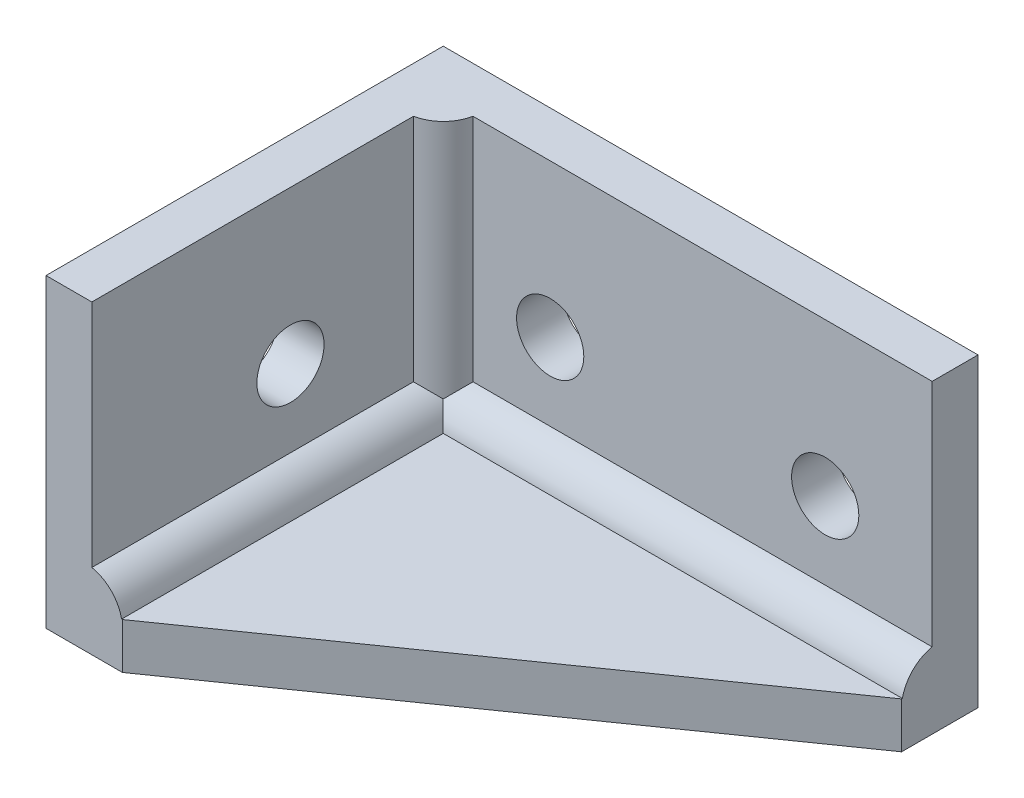
ISO-10303-21;
HEADER;
FILE_DESCRIPTION(('STEP AP214'),'2;1');
FILE_NAME('part.step','',(''),(''),'','','');
FILE_SCHEMA(('AUTOMOTIVE_DESIGN { 1 0 10303 214 1 1 1 1 }'));
ENDSEC;
DATA;
#1=APPLICATION_CONTEXT('core data for automotive mechanical design processes');
#2=APPLICATION_PROTOCOL_DEFINITION('international standard','automotive_design',2000,#1);
#3=PRODUCT_CONTEXT('',#1,'mechanical');
#4=PRODUCT('Part','Part','',(#3));
#5=PRODUCT_RELATED_PRODUCT_CATEGORY('part','',(#4));
#6=PRODUCT_DEFINITION_FORMATION('','',#4);
#7=PRODUCT_DEFINITION_CONTEXT('part definition',#1,'design');
#8=PRODUCT_DEFINITION('design','',#6,#7);
#9=PRODUCT_DEFINITION_SHAPE('','',#8);
#10=(LENGTH_UNIT() NAMED_UNIT(*) SI_UNIT(.MILLI.,.METRE.));
#11=(NAMED_UNIT(*) PLANE_ANGLE_UNIT() SI_UNIT($,.RADIAN.));
#12=(NAMED_UNIT(*) SI_UNIT($,.STERADIAN.) SOLID_ANGLE_UNIT());
#13=UNCERTAINTY_MEASURE_WITH_UNIT(LENGTH_MEASURE(1.E-05),#10,'distance_accuracy_value','');
#14=(GEOMETRIC_REPRESENTATION_CONTEXT(3) GLOBAL_UNCERTAINTY_ASSIGNED_CONTEXT((#13)) GLOBAL_UNIT_ASSIGNED_CONTEXT((#10,
#11,#12)) REPRESENTATION_CONTEXT('',''));
#15=CARTESIAN_POINT('',(0.,0.,0.));
#16=DIRECTION('',(0.,0.,1.));
#17=DIRECTION('',(1.,0.,0.));
#18=AXIS2_PLACEMENT_3D('',#15,#16,#17);
#19=CARTESIAN_POINT('',(35.,20.,5.));
#20=DIRECTION('',(-0.573462344363328,0.,-0.81923192051904));
#21=DIRECTION('',(-0.819231920519041,0.,0.573462344363328));
#22=AXIS2_PLACEMENT_3D('',#19,#20,#21);
#23=PLANE('',#22);
#24=DIRECTION('',(0.81923192051904,0.,-0.573462344363328));
#25=VECTOR('',#24,1.);
#26=CARTESIAN_POINT('',(5.,3.,26.));
#27=LINE('',#26,#25);
#28=CARTESIAN_POINT('',(5.,3.,26.));
#29=VERTEX_POINT('',#28);
#30=CARTESIAN_POINT('',(35.,3.,5.));
#31=VERTEX_POINT('',#30);
#32=EDGE_CURVE('E161',#29,#31,#27,.T.);
#33=ORIENTED_EDGE('',*,*,#32,.F.);
#34=DIRECTION('',(0.,-1.,0.));
#35=VECTOR('',#34,1.);
#36=CARTESIAN_POINT('',(5.,20.,26.));
#37=LINE('',#36,#35);
#38=CARTESIAN_POINT('',(5.,0.,26.));
#39=VERTEX_POINT('',#38);
#40=EDGE_CURVE('E40',#29,#39,#37,.T.);
#41=ORIENTED_EDGE('',*,*,#40,.T.);
#42=DIRECTION('',(0.81923192051904,0.,-0.573462344363328));
#43=VECTOR('',#42,1.);
#44=CARTESIAN_POINT('',(35.,0.,5.));
#45=LINE('',#44,#43);
#46=CARTESIAN_POINT('',(35.,0.,5.));
#47=VERTEX_POINT('',#46);
#48=EDGE_CURVE('E188',#39,#47,#45,.T.);
#49=ORIENTED_EDGE('',*,*,#48,.T.);
#50=DIRECTION('',(0.,-1.,0.));
#51=VECTOR('',#50,1.);
#52=CARTESIAN_POINT('',(35.,20.,5.));
#53=LINE('',#52,#51);
#54=EDGE_CURVE('E199',#31,#47,#53,.T.);
#55=ORIENTED_EDGE('',*,*,#54,.F.);
#56=EDGE_LOOP('',(#33,#41,#49,#55));
#57=FACE_BOUND('',#56,.T.);
#58=ADVANCED_FACE('F32',(#57),#23,.F.);
#59=CARTESIAN_POINT('',(0.,20.,26.));
#60=DIRECTION('',(1.,0.,0.));
#61=DIRECTION('',(0.,0.,-1.));
#62=AXIS2_PLACEMENT_3D('',#59,#60,#61);
#63=PLANE('',#62);
#64=CARTESIAN_POINT('',(0.,10.,13.));
#65=DIRECTION('',(1.,0.,0.));
#66=DIRECTION('',(0.,0.,-1.));
#67=AXIS2_PLACEMENT_3D('',#64,#65,#66);
#68=CIRCLE('',#67,2.2);
#69=CARTESIAN_POINT('',(0.,10.,10.8));
#70=VERTEX_POINT('',#69);
#71=EDGE_CURVE('E244',#70,#70,#68,.T.);
#72=ORIENTED_EDGE('',*,*,#71,.T.);
#73=EDGE_LOOP('',(#72));
#74=FACE_BOUND('',#73,.T.);
#75=DIRECTION('',(0.,0.,1.));
#76=VECTOR('',#75,1.);
#77=CARTESIAN_POINT('',(0.,0.,26.));
#78=LINE('',#77,#76);
#79=CARTESIAN_POINT('',(0.,0.,0.));
#80=VERTEX_POINT('',#79);
#81=CARTESIAN_POINT('',(0.,0.,26.));
#82=VERTEX_POINT('',#81);
#83=EDGE_CURVE('E169',#80,#82,#78,.T.);
#84=ORIENTED_EDGE('',*,*,#83,.T.);
#85=DIRECTION('',(0.,-1.,0.));
#86=VECTOR('',#85,1.);
#87=CARTESIAN_POINT('',(0.,20.,26.));
#88=LINE('',#87,#86);
#89=CARTESIAN_POINT('',(0.,20.,26.));
#90=VERTEX_POINT('',#89);
#91=EDGE_CURVE('E11',#90,#82,#88,.T.);
#92=ORIENTED_EDGE('',*,*,#91,.F.);
#93=DIRECTION('',(0.,0.,1.));
#94=VECTOR('',#93,1.);
#95=CARTESIAN_POINT('',(0.,20.,26.));
#96=LINE('',#95,#94);
#97=CARTESIAN_POINT('',(0.,20.,0.));
#98=VERTEX_POINT('',#97);
#99=EDGE_CURVE('E171',#98,#90,#96,.T.);
#100=ORIENTED_EDGE('',*,*,#99,.F.);
#101=DIRECTION('',(0.,-1.,0.));
#102=VECTOR('',#101,1.);
#103=CARTESIAN_POINT('',(0.,20.,0.));
#104=LINE('',#103,#102);
#105=EDGE_CURVE('E182',#98,#80,#104,.T.);
#106=ORIENTED_EDGE('',*,*,#105,.T.);
#107=EDGE_LOOP('',(#84,#92,#100,#106));
#108=FACE_BOUND('',#107,.T.);
#109=ADVANCED_FACE('F34',(#74,#108),#63,.F.);
#110=CARTESIAN_POINT('',(5.,20.,26.));
#111=DIRECTION('',(0.,0.,-1.));
#112=DIRECTION('',(-1.,0.,0.));
#113=AXIS2_PLACEMENT_3D('',#110,#111,#112);
#114=PLANE('',#113);
#115=CARTESIAN_POINT('',(2.5,2.5,26.));
#116=DIRECTION('',(0.,0.,1.));
#117=DIRECTION('',(1.,0.,0.));
#118=AXIS2_PLACEMENT_3D('',#115,#116,#117);
#119=CIRCLE('',#118,2.5);
#120=CARTESIAN_POINT('',(4.94948974278318,3.,26.));
#121=VERTEX_POINT('',#120);
#122=CARTESIAN_POINT('',(3.,4.94948974278318,26.));
#123=VERTEX_POINT('',#122);
#124=EDGE_CURVE('E148',#121,#123,#119,.T.);
#125=ORIENTED_EDGE('',*,*,#124,.T.);
#126=DIRECTION('',(0.,1.,0.));
#127=VECTOR('',#126,1.);
#128=CARTESIAN_POINT('',(3.,3.,26.));
#129=LINE('',#128,#127);
#130=CARTESIAN_POINT('',(3.,20.,26.));
#131=VERTEX_POINT('',#130);
#132=EDGE_CURVE('E166',#123,#131,#129,.T.);
#133=ORIENTED_EDGE('',*,*,#132,.T.);
#134=DIRECTION('',(1.,0.,0.));
#135=VECTOR('',#134,1.);
#136=CARTESIAN_POINT('',(5.,20.,26.));
#137=LINE('',#136,#135);
#138=EDGE_CURVE('E174',#90,#131,#137,.T.);
#139=ORIENTED_EDGE('',*,*,#138,.F.);
#140=ORIENTED_EDGE('',*,*,#91,.T.);
#141=DIRECTION('',(1.,0.,0.));
#142=VECTOR('',#141,1.);
#143=CARTESIAN_POINT('',(5.,0.,26.));
#144=LINE('',#143,#142);
#145=EDGE_CURVE('E185',#82,#39,#144,.T.);
#146=ORIENTED_EDGE('',*,*,#145,.T.);
#147=ORIENTED_EDGE('',*,*,#40,.F.);
#148=DIRECTION('',(1.,0.,0.));
#149=VECTOR('',#148,1.);
#150=CARTESIAN_POINT('',(3.,3.,26.));
#151=LINE('',#150,#149);
#152=EDGE_CURVE('E158',#121,#29,#151,.T.);
#153=ORIENTED_EDGE('',*,*,#152,.F.);
#154=EDGE_LOOP('',(#125,#133,#139,#140,#146,#147,#153));
#155=FACE_BOUND('',#154,.T.);
#156=ADVANCED_FACE('F208',(#155),#114,.F.);
#157=CARTESIAN_POINT('',(35.,20.,0.));
#158=DIRECTION('',(-1.,0.,0.));
#159=DIRECTION('',(0.,0.,1.));
#160=AXIS2_PLACEMENT_3D('',#157,#158,#159);
#161=PLANE('',#160);
#162=DIRECTION('',(0.,1.,0.));
#163=VECTOR('',#162,1.);
#164=CARTESIAN_POINT('',(35.,3.,3.));
#165=LINE('',#164,#163);
#166=CARTESIAN_POINT('',(35.,4.94948974278318,3.));
#167=VERTEX_POINT('',#166);
#168=CARTESIAN_POINT('',(35.,20.,3.));
#169=VERTEX_POINT('',#168);
#170=EDGE_CURVE('E163',#167,#169,#165,.T.);
#171=ORIENTED_EDGE('',*,*,#170,.F.);
#172=CARTESIAN_POINT('',(35.,2.5,2.5));
#173=DIRECTION('',(1.,0.,0.));
#174=DIRECTION('',(0.,0.,-1.));
#175=AXIS2_PLACEMENT_3D('',#172,#173,#174);
#176=CIRCLE('',#175,2.5);
#177=CARTESIAN_POINT('',(35.,3.,4.94948974278318));
#178=VERTEX_POINT('',#177);
#179=EDGE_CURVE('E124',#167,#178,#176,.T.);
#180=ORIENTED_EDGE('',*,*,#179,.T.);
#181=DIRECTION('',(0.,0.,-1.));
#182=VECTOR('',#181,1.);
#183=CARTESIAN_POINT('',(35.,3.,5.));
#184=LINE('',#183,#182);
#185=EDGE_CURVE('E156',#31,#178,#184,.T.);
#186=ORIENTED_EDGE('',*,*,#185,.F.);
#187=ORIENTED_EDGE('',*,*,#54,.T.);
#188=DIRECTION('',(0.,0.,-1.));
#189=VECTOR('',#188,1.);
#190=CARTESIAN_POINT('',(35.,0.,0.));
#191=LINE('',#190,#189);
#192=CARTESIAN_POINT('',(35.,0.,0.));
#193=VERTEX_POINT('',#192);
#194=EDGE_CURVE('E191',#47,#193,#191,.T.);
#195=ORIENTED_EDGE('',*,*,#194,.T.);
#196=DIRECTION('',(0.,-1.,0.));
#197=VECTOR('',#196,1.);
#198=CARTESIAN_POINT('',(35.,20.,0.));
#199=LINE('',#198,#197);
#200=CARTESIAN_POINT('',(35.,20.,0.));
#201=VERTEX_POINT('',#200);
#202=EDGE_CURVE('E196',#201,#193,#199,.T.);
#203=ORIENTED_EDGE('',*,*,#202,.F.);
#204=DIRECTION('',(0.,0.,-1.));
#205=VECTOR('',#204,1.);
#206=CARTESIAN_POINT('',(35.,20.,0.));
#207=LINE('',#206,#205);
#208=EDGE_CURVE('E178',#169,#201,#207,.T.);
#209=ORIENTED_EDGE('',*,*,#208,.F.);
#210=EDGE_LOOP('',(#171,#180,#186,#187,#195,#203,#209));
#211=FACE_BOUND('',#210,.T.);
#212=ADVANCED_FACE('F216',(#211),#161,.F.);
#213=CARTESIAN_POINT('',(0.,20.,0.));
#214=DIRECTION('',(0.,0.,1.));
#215=DIRECTION('',(1.,0.,0.));
#216=AXIS2_PLACEMENT_3D('',#213,#214,#215);
#217=PLANE('',#216);
#218=CARTESIAN_POINT('',(28.,10.,0.));
#219=DIRECTION('',(0.,0.,1.));
#220=DIRECTION('',(1.,0.,0.));
#221=AXIS2_PLACEMENT_3D('',#218,#219,#220);
#222=CIRCLE('',#221,2.19999999999999);
#223=CARTESIAN_POINT('',(30.2,10.,0.));
#224=VERTEX_POINT('',#223);
#225=EDGE_CURVE('E239',#224,#224,#222,.T.);
#226=ORIENTED_EDGE('',*,*,#225,.T.);
#227=EDGE_LOOP('',(#226));
#228=FACE_BOUND('',#227,.T.);
#229=CARTESIAN_POINT('',(10.,10.,0.));
#230=DIRECTION('',(0.,0.,1.));
#231=DIRECTION('',(1.,0.,0.));
#232=AXIS2_PLACEMENT_3D('',#229,#230,#231);
#233=CIRCLE('',#232,2.2);
#234=CARTESIAN_POINT('',(12.2,10.,0.));
#235=VERTEX_POINT('',#234);
#236=EDGE_CURVE('E232',#235,#235,#233,.T.);
#237=ORIENTED_EDGE('',*,*,#236,.T.);
#238=EDGE_LOOP('',(#237));
#239=FACE_BOUND('',#238,.T.);
#240=DIRECTION('',(-1.,0.,0.));
#241=VECTOR('',#240,1.);
#242=CARTESIAN_POINT('',(0.,0.,0.));
#243=LINE('',#242,#241);
#244=EDGE_CURVE('E175',#193,#80,#243,.T.);
#245=ORIENTED_EDGE('',*,*,#244,.T.);
#246=ORIENTED_EDGE('',*,*,#105,.F.);
#247=DIRECTION('',(-1.,0.,0.));
#248=VECTOR('',#247,1.);
#249=CARTESIAN_POINT('',(0.,20.,0.));
#250=LINE('',#249,#248);
#251=EDGE_CURVE('E180',#201,#98,#250,.T.);
#252=ORIENTED_EDGE('',*,*,#251,.F.);
#253=ORIENTED_EDGE('',*,*,#202,.T.);
#254=EDGE_LOOP('',(#245,#246,#252,#253));
#255=FACE_BOUND('',#254,.T.);
#256=ADVANCED_FACE('F221',(#228,#239,#255),#217,.F.);
#257=CARTESIAN_POINT('',(0.,20.,0.));
#258=DIRECTION('',(0.,-1.,0.));
#259=DIRECTION('',(0.,0.,-1.));
#260=AXIS2_PLACEMENT_3D('',#257,#258,#259);
#261=PLANE('',#260);
#262=DIRECTION('',(0.,0.,1.));
#263=VECTOR('',#262,1.);
#264=CARTESIAN_POINT('',(3.,20.,3.));
#265=LINE('',#264,#263);
#266=CARTESIAN_POINT('',(3.,20.,4.94948974278318));
#267=VERTEX_POINT('',#266);
#268=EDGE_CURVE('E159',#267,#131,#265,.T.);
#269=ORIENTED_EDGE('',*,*,#268,.F.);
#270=CARTESIAN_POINT('',(2.5,20.,2.5));
#271=DIRECTION('',(0.,1.,0.));
#272=DIRECTION('',(0.,0.,1.));
#273=AXIS2_PLACEMENT_3D('',#270,#271,#272);
#274=CIRCLE('',#273,2.5);
#275=CARTESIAN_POINT('',(4.94948974278318,20.,3.));
#276=VERTEX_POINT('',#275);
#277=EDGE_CURVE('E133',#267,#276,#274,.T.);
#278=ORIENTED_EDGE('',*,*,#277,.T.);
#279=DIRECTION('',(-1.,0.,0.));
#280=VECTOR('',#279,1.);
#281=CARTESIAN_POINT('',(35.,20.,3.));
#282=LINE('',#281,#280);
#283=EDGE_CURVE('E55',#169,#276,#282,.T.);
#284=ORIENTED_EDGE('',*,*,#283,.F.);
#285=ORIENTED_EDGE('',*,*,#208,.T.);
#286=ORIENTED_EDGE('',*,*,#251,.T.);
#287=ORIENTED_EDGE('',*,*,#99,.T.);
#288=ORIENTED_EDGE('',*,*,#138,.T.);
#289=EDGE_LOOP('',(#269,#278,#284,#285,#286,#287,#288));
#290=FACE_BOUND('',#289,.T.);
#291=ADVANCED_FACE('F225',(#290),#261,.F.);
#292=CARTESIAN_POINT('',(0.,0.,0.));
#293=DIRECTION('',(0.,-1.,0.));
#294=DIRECTION('',(0.,0.,-1.));
#295=AXIS2_PLACEMENT_3D('',#292,#293,#294);
#296=PLANE('',#295);
#297=ORIENTED_EDGE('',*,*,#83,.F.);
#298=ORIENTED_EDGE('',*,*,#244,.F.);
#299=ORIENTED_EDGE('',*,*,#194,.F.);
#300=ORIENTED_EDGE('',*,*,#48,.F.);
#301=ORIENTED_EDGE('',*,*,#145,.F.);
#302=EDGE_LOOP('',(#297,#298,#299,#300,#301));
#303=FACE_BOUND('',#302,.T.);
#304=ADVANCED_FACE('F212',(#303),#296,.T.);
#305=CARTESIAN_POINT('',(3.,3.,3.));
#306=DIRECTION('',(-1.,0.,0.));
#307=DIRECTION('',(0.,0.,1.));
#308=AXIS2_PLACEMENT_3D('',#305,#306,#307);
#309=PLANE('',#308);
#310=CARTESIAN_POINT('',(3.00000000000001,10.,13.));
#311=DIRECTION('',(1.,0.,0.));
#312=DIRECTION('',(0.,0.,-1.));
#313=AXIS2_PLACEMENT_3D('',#310,#311,#312);
#314=CIRCLE('',#313,2.2);
#315=CARTESIAN_POINT('',(3.00000000000001,10.,10.8));
#316=VERTEX_POINT('',#315);
#317=EDGE_CURVE('E247',#316,#316,#314,.T.);
#318=ORIENTED_EDGE('',*,*,#317,.F.);
#319=EDGE_LOOP('',(#318));
#320=FACE_BOUND('',#319,.T.);
#321=DIRECTION('',(0.,0.,1.));
#322=VECTOR('',#321,1.);
#323=CARTESIAN_POINT('',(3.,4.94948974278318,-500000.));
#324=LINE('',#323,#322);
#325=CARTESIAN_POINT('',(3.,4.94948974278318,4.949489742786));
#326=VERTEX_POINT('',#325);
#327=EDGE_CURVE('E152',#326,#123,#324,.T.);
#328=ORIENTED_EDGE('',*,*,#327,.F.);
#329=DIRECTION('',(0.,1.,0.));
#330=VECTOR('',#329,1.);
#331=CARTESIAN_POINT('',(3.,-500000.,4.94948974278318));
#332=LINE('',#331,#330);
#333=EDGE_CURVE('E47',#267,#326,#332,.F.);
#334=ORIENTED_EDGE('',*,*,#333,.F.);
#335=ORIENTED_EDGE('',*,*,#268,.T.);
#336=ORIENTED_EDGE('',*,*,#132,.F.);
#337=EDGE_LOOP('',(#328,#334,#335,#336));
#338=FACE_BOUND('',#337,.T.);
#339=ADVANCED_FACE('F262',(#320,#338),#309,.F.);
#340=CARTESIAN_POINT('',(35.,3.,3.));
#341=DIRECTION('',(0.,0.,-1.));
#342=DIRECTION('',(-1.,0.,0.));
#343=AXIS2_PLACEMENT_3D('',#340,#341,#342);
#344=PLANE('',#343);
#345=CARTESIAN_POINT('',(28.,10.,3.));
#346=DIRECTION('',(0.,0.,1.));
#347=DIRECTION('',(1.,0.,0.));
#348=AXIS2_PLACEMENT_3D('',#345,#346,#347);
#349=CIRCLE('',#348,2.19999999999999);
#350=CARTESIAN_POINT('',(30.2,10.,3.));
#351=VERTEX_POINT('',#350);
#352=EDGE_CURVE('E241',#351,#351,#349,.T.);
#353=ORIENTED_EDGE('',*,*,#352,.F.);
#354=EDGE_LOOP('',(#353));
#355=FACE_BOUND('',#354,.T.);
#356=CARTESIAN_POINT('',(10.,10.,3.));
#357=DIRECTION('',(0.,0.,1.));
#358=DIRECTION('',(1.,0.,0.));
#359=AXIS2_PLACEMENT_3D('',#356,#357,#358);
#360=CIRCLE('',#359,2.2);
#361=CARTESIAN_POINT('',(12.2,10.,3.));
#362=VERTEX_POINT('',#361);
#363=EDGE_CURVE('E234',#362,#362,#360,.T.);
#364=ORIENTED_EDGE('',*,*,#363,.F.);
#365=EDGE_LOOP('',(#364));
#366=FACE_BOUND('',#365,.T.);
#367=ORIENTED_EDGE('',*,*,#283,.T.);
#368=DIRECTION('',(0.,1.,0.));
#369=VECTOR('',#368,1.);
#370=CARTESIAN_POINT('',(4.94948974278318,-500000.,3.));
#371=LINE('',#370,#369);
#372=CARTESIAN_POINT('',(4.949489742786,4.94948974277073,3.00000000006099));
#373=VERTEX_POINT('',#372);
#374=EDGE_CURVE('E128',#373,#276,#371,.T.);
#375=ORIENTED_EDGE('',*,*,#374,.F.);
#376=DIRECTION('',(1.,0.,0.));
#377=VECTOR('',#376,1.);
#378=CARTESIAN_POINT('',(-500000.,4.94948974277073,3.00000000006099));
#379=LINE('',#378,#377);
#380=EDGE_CURVE('E116',#167,#373,#379,.F.);
#381=ORIENTED_EDGE('',*,*,#380,.F.);
#382=ORIENTED_EDGE('',*,*,#170,.T.);
#383=EDGE_LOOP('',(#367,#375,#381,#382));
#384=FACE_BOUND('',#383,.T.);
#385=ADVANCED_FACE('F129',(#355,#366,#384),#344,.F.);
#386=CARTESIAN_POINT('',(0.,3.,0.));
#387=DIRECTION('',(0.,1.,0.));
#388=DIRECTION('',(0.,0.,1.));
#389=AXIS2_PLACEMENT_3D('',#386,#387,#388);
#390=PLANE('',#389);
#391=DIRECTION('',(1.,0.,0.));
#392=VECTOR('',#391,1.);
#393=CARTESIAN_POINT('',(-500000.,3.,4.94948974278318));
#394=LINE('',#393,#392);
#395=CARTESIAN_POINT('',(4.94948974278486,3.,4.94948974278318));
#396=VERTEX_POINT('',#395);
#397=EDGE_CURVE('E146',#178,#396,#394,.F.);
#398=ORIENTED_EDGE('',*,*,#397,.T.);
#399=DIRECTION('',(0.,0.,1.));
#400=VECTOR('',#399,1.);
#401=CARTESIAN_POINT('',(4.94948974278318,3.,-500000.));
#402=LINE('',#401,#400);
#403=EDGE_CURVE('E153',#396,#121,#402,.T.);
#404=ORIENTED_EDGE('',*,*,#403,.T.);
#405=ORIENTED_EDGE('',*,*,#152,.T.);
#406=ORIENTED_EDGE('',*,*,#32,.T.);
#407=ORIENTED_EDGE('',*,*,#185,.T.);
#408=EDGE_LOOP('',(#398,#404,#405,#406,#407));
#409=FACE_BOUND('',#408,.T.);
#410=ADVANCED_FACE('F227',(#409),#390,.T.);
#411=CARTESIAN_POINT('',(2.5,2.5,-500000.));
#412=DIRECTION('',(0.,0.,1.));
#413=DIRECTION('',(1.,0.,0.));
#414=AXIS2_PLACEMENT_3D('',#411,#412,#413);
#415=CYLINDRICAL_SURFACE('',#414,2.5);
#416=CARTESIAN_POINT('',(2.5,2.49999999999886,2.49999999999886));
#417=DIRECTION('',(0.,0.707106781186547,-0.707106781186547));
#418=DIRECTION('',(0.,0.707106781186547,0.707106781186547));
#419=AXIS2_PLACEMENT_3D('',#416,#417,#418);
#420=ELLIPSE('',#419,3.53553390593274,2.5);
#421=CARTESIAN_POINT('',(4.2677669529658,4.2677669529658,4.2677669529658));
#422=VERTEX_POINT('',#421);
#423=EDGE_CURVE('E137',#422,#326,#420,.F.);
#424=ORIENTED_EDGE('',*,*,#423,.T.);
#425=ORIENTED_EDGE('',*,*,#327,.T.);
#426=ORIENTED_EDGE('',*,*,#124,.F.);
#427=ORIENTED_EDGE('',*,*,#403,.F.);
#428=CARTESIAN_POINT('',(2.49999999999886,2.5,2.49999999999886));
#429=DIRECTION('',(0.707106781186547,0.,-0.707106781186547));
#430=DIRECTION('',(0.707106781186547,0.,0.707106781186547));
#431=AXIS2_PLACEMENT_3D('',#428,#429,#430);
#432=ELLIPSE('',#431,3.53553390593274,2.5);
#433=EDGE_CURVE('E126',#396,#422,#432,.F.);
#434=ORIENTED_EDGE('',*,*,#433,.T.);
#435=EDGE_LOOP('',(#424,#425,#426,#427,#434));
#436=FACE_BOUND('',#435,.T.);
#437=ADVANCED_FACE('F229',(#436),#415,.T.);
#438=CARTESIAN_POINT('',(-500000.,2.5,2.5));
#439=DIRECTION('',(1.,0.,0.));
#440=DIRECTION('',(0.,0.,-1.));
#441=AXIS2_PLACEMENT_3D('',#438,#439,#440);
#442=CYLINDRICAL_SURFACE('',#441,2.5);
#443=CARTESIAN_POINT('',(2.49999999999886,2.49999999999886,2.5));
#444=DIRECTION('',(-0.707106781186547,0.707106781186547,0.));
#445=DIRECTION('',(0.707106781186547,0.707106781186547,0.));
#446=AXIS2_PLACEMENT_3D('',#443,#444,#445);
#447=ELLIPSE('',#446,3.53553390593274,2.5);
#448=EDGE_CURVE('E120',#373,#422,#447,.F.);
#449=ORIENTED_EDGE('',*,*,#448,.T.);
#450=ORIENTED_EDGE('',*,*,#433,.F.);
#451=ORIENTED_EDGE('',*,*,#397,.F.);
#452=ORIENTED_EDGE('',*,*,#179,.F.);
#453=ORIENTED_EDGE('',*,*,#380,.T.);
#454=EDGE_LOOP('',(#449,#450,#451,#452,#453));
#455=FACE_BOUND('',#454,.T.);
#456=ADVANCED_FACE('F117',(#455),#442,.T.);
#457=CARTESIAN_POINT('',(2.5,-500000.,2.5));
#458=DIRECTION('',(0.,1.,0.));
#459=DIRECTION('',(0.,0.,1.));
#460=AXIS2_PLACEMENT_3D('',#457,#458,#459);
#461=CYLINDRICAL_SURFACE('',#460,2.5);
#462=ORIENTED_EDGE('',*,*,#277,.F.);
#463=ORIENTED_EDGE('',*,*,#333,.T.);
#464=ORIENTED_EDGE('',*,*,#423,.F.);
#465=ORIENTED_EDGE('',*,*,#448,.F.);
#466=ORIENTED_EDGE('',*,*,#374,.T.);
#467=EDGE_LOOP('',(#462,#463,#464,#465,#466));
#468=FACE_BOUND('',#467,.T.);
#469=ADVANCED_FACE('F136',(#468),#461,.T.);
#470=CARTESIAN_POINT('',(10.,10.,0.));
#471=DIRECTION('',(0.,0.,1.));
#472=DIRECTION('',(1.,0.,0.));
#473=AXIS2_PLACEMENT_3D('',#470,#471,#472);
#474=CYLINDRICAL_SURFACE('',#473,2.2);
#475=ORIENTED_EDGE('',*,*,#236,.F.);
#476=EDGE_LOOP('',(#475));
#477=FACE_BOUND('',#476,.T.);
#478=ORIENTED_EDGE('',*,*,#363,.T.);
#479=EDGE_LOOP('',(#478));
#480=FACE_BOUND('',#479,.T.);
#481=ADVANCED_FACE('F296',(#477,#480),#474,.F.);
#482=CARTESIAN_POINT('',(28.,10.,0.));
#483=DIRECTION('',(0.,0.,1.));
#484=DIRECTION('',(1.,0.,0.));
#485=AXIS2_PLACEMENT_3D('',#482,#483,#484);
#486=CYLINDRICAL_SURFACE('',#485,2.19999999999999);
#487=ORIENTED_EDGE('',*,*,#225,.F.);
#488=EDGE_LOOP('',(#487));
#489=FACE_BOUND('',#488,.T.);
#490=ORIENTED_EDGE('',*,*,#352,.T.);
#491=EDGE_LOOP('',(#490));
#492=FACE_BOUND('',#491,.T.);
#493=ADVANCED_FACE('F258',(#489,#492),#486,.F.);
#494=CARTESIAN_POINT('',(0.,10.,13.));
#495=DIRECTION('',(1.,0.,0.));
#496=DIRECTION('',(0.,0.,-1.));
#497=AXIS2_PLACEMENT_3D('',#494,#495,#496);
#498=CYLINDRICAL_SURFACE('',#497,2.2);
#499=ORIENTED_EDGE('',*,*,#71,.F.);
#500=EDGE_LOOP('',(#499));
#501=FACE_BOUND('',#500,.T.);
#502=ORIENTED_EDGE('',*,*,#317,.T.);
#503=EDGE_LOOP('',(#502));
#504=FACE_BOUND('',#503,.T.);
#505=ADVANCED_FACE('F255',(#501,#504),#498,.F.);
#506=CLOSED_SHELL('',(#58,#109,#156,#212,#256,#291,#304,#339,#385,#410,#437,#456,#469,#481,#493,#505));
#507=MANIFOLD_SOLID_BREP('B2',#506);
#508=ADVANCED_BREP_SHAPE_REPRESENTATION('',(#18,#507),#14);
#509=SHAPE_DEFINITION_REPRESENTATION(#9,#508);
ENDSEC;
END-ISO-10303-21;
